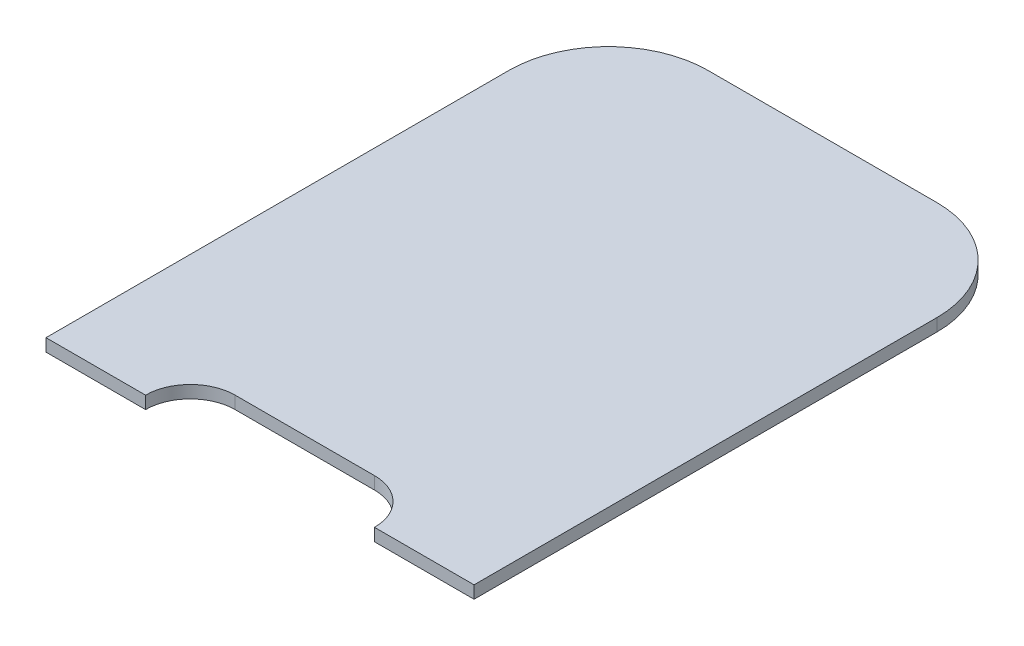
ISO-10303-21;
HEADER;
FILE_DESCRIPTION(('STEP AP214'),'2;1');
FILE_NAME('part.step','',(''),(''),'','','');
FILE_SCHEMA(('AUTOMOTIVE_DESIGN { 1 0 10303 214 1 1 1 1 }'));
ENDSEC;
DATA;
#1=APPLICATION_CONTEXT('core data for automotive mechanical design processes');
#2=APPLICATION_PROTOCOL_DEFINITION('international standard','automotive_design',2000,#1);
#3=PRODUCT_CONTEXT('',#1,'mechanical');
#4=PRODUCT('Part','Part','',(#3));
#5=PRODUCT_RELATED_PRODUCT_CATEGORY('part','',(#4));
#6=PRODUCT_DEFINITION_FORMATION('','',#4);
#7=PRODUCT_DEFINITION_CONTEXT('part definition',#1,'design');
#8=PRODUCT_DEFINITION('design','',#6,#7);
#9=PRODUCT_DEFINITION_SHAPE('','',#8);
#10=(LENGTH_UNIT() NAMED_UNIT(*) SI_UNIT(.MILLI.,.METRE.));
#11=(NAMED_UNIT(*) PLANE_ANGLE_UNIT() SI_UNIT($,.RADIAN.));
#12=(NAMED_UNIT(*) SI_UNIT($,.STERADIAN.) SOLID_ANGLE_UNIT());
#13=UNCERTAINTY_MEASURE_WITH_UNIT(LENGTH_MEASURE(1.E-05),#10,'distance_accuracy_value','');
#14=(GEOMETRIC_REPRESENTATION_CONTEXT(3) GLOBAL_UNCERTAINTY_ASSIGNED_CONTEXT((#13)) GLOBAL_UNIT_ASSIGNED_CONTEXT((#10,
#11,#12)) REPRESENTATION_CONTEXT('',''));
#15=CARTESIAN_POINT('',(0.,0.,0.));
#16=DIRECTION('',(0.,0.,1.));
#17=DIRECTION('',(1.,0.,0.));
#18=AXIS2_PLACEMENT_3D('',#15,#16,#17);
#19=CARTESIAN_POINT('',(0.,1.6,-59.0549999999999));
#20=DIRECTION('',(1.,0.,0.));
#21=DIRECTION('',(0.,0.,-1.));
#22=AXIS2_PLACEMENT_3D('',#19,#20,#21);
#23=PLANE('',#22);
#24=DIRECTION('',(0.,0.,1.));
#25=VECTOR('',#24,1.);
#26=CARTESIAN_POINT('',(0.,0.,-59.0549999999999));
#27=LINE('',#26,#25);
#28=CARTESIAN_POINT('',(0.,0.,-59.0549999999999));
#29=VERTEX_POINT('',#28);
#30=CARTESIAN_POINT('',(0.,0.,0.));
#31=VERTEX_POINT('',#30);
#32=EDGE_CURVE('E141',#29,#31,#27,.T.);
#33=ORIENTED_EDGE('',*,*,#32,.T.);
#34=DIRECTION('',(0.,-1.,0.));
#35=VECTOR('',#34,1.);
#36=CARTESIAN_POINT('',(0.,1.6,0.));
#37=LINE('',#36,#35);
#38=CARTESIAN_POINT('',(0.,1.6,0.));
#39=VERTEX_POINT('',#38);
#40=EDGE_CURVE('E11',#39,#31,#37,.T.);
#41=ORIENTED_EDGE('',*,*,#40,.F.);
#42=DIRECTION('',(0.,0.,1.));
#43=VECTOR('',#42,1.);
#44=CARTESIAN_POINT('',(0.,1.6,-59.0549999999999));
#45=LINE('',#44,#43);
#46=CARTESIAN_POINT('',(0.,1.6,-59.0549999999999));
#47=VERTEX_POINT('',#46);
#48=EDGE_CURVE('E159',#47,#39,#45,.T.);
#49=ORIENTED_EDGE('',*,*,#48,.F.);
#50=DIRECTION('',(0.,-1.,0.));
#51=VECTOR('',#50,1.);
#52=CARTESIAN_POINT('',(0.,1.6,-59.0549999999999));
#53=LINE('',#52,#51);
#54=EDGE_CURVE('E137',#47,#29,#53,.T.);
#55=ORIENTED_EDGE('',*,*,#54,.T.);
#56=EDGE_LOOP('',(#33,#41,#49,#55));
#57=FACE_BOUND('',#56,.T.);
#58=ADVANCED_FACE('F33',(#57),#23,.F.);
#59=CARTESIAN_POINT('',(0.,1.6,0.));
#60=DIRECTION('',(0.,0.,-1.));
#61=DIRECTION('',(-1.,0.,0.));
#62=AXIS2_PLACEMENT_3D('',#59,#60,#61);
#63=PLANE('',#62);
#64=DIRECTION('',(1.,0.,0.));
#65=VECTOR('',#64,1.);
#66=CARTESIAN_POINT('',(0.,0.,0.));
#67=LINE('',#66,#65);
#68=CARTESIAN_POINT('',(12.7,0.,0.));
#69=VERTEX_POINT('',#68);
#70=EDGE_CURVE('E144',#31,#69,#67,.T.);
#71=ORIENTED_EDGE('',*,*,#70,.T.);
#72=DIRECTION('',(0.,-1.,0.));
#73=VECTOR('',#72,1.);
#74=CARTESIAN_POINT('',(12.7,1.6,0.));
#75=LINE('',#74,#73);
#76=CARTESIAN_POINT('',(12.7,1.6,0.));
#77=VERTEX_POINT('',#76);
#78=EDGE_CURVE('E41',#77,#69,#75,.T.);
#79=ORIENTED_EDGE('',*,*,#78,.F.);
#80=DIRECTION('',(1.,0.,0.));
#81=VECTOR('',#80,1.);
#82=CARTESIAN_POINT('',(0.,1.6,0.));
#83=LINE('',#82,#81);
#84=EDGE_CURVE('E98',#39,#77,#83,.T.);
#85=ORIENTED_EDGE('',*,*,#84,.F.);
#86=ORIENTED_EDGE('',*,*,#40,.T.);
#87=EDGE_LOOP('',(#71,#79,#85,#86));
#88=FACE_BOUND('',#87,.T.);
#89=ADVANCED_FACE('F208',(#88),#63,.F.);
#90=CARTESIAN_POINT('',(18.415,1.6,0.));
#91=DIRECTION('',(0.,-1.,0.));
#92=DIRECTION('',(0.,0.,-1.));
#93=AXIS2_PLACEMENT_3D('',#90,#91,#92);
#94=CYLINDRICAL_SURFACE('',#93,5.715);
#95=CARTESIAN_POINT('',(18.415,0.,0.));
#96=DIRECTION('',(0.,-1.,0.));
#97=DIRECTION('',(0.,0.,1.));
#98=AXIS2_PLACEMENT_3D('',#95,#96,#97);
#99=CIRCLE('',#98,5.715);
#100=CARTESIAN_POINT('',(18.415,0.,-5.715));
#101=VERTEX_POINT('',#100);
#102=EDGE_CURVE('E146',#69,#101,#99,.T.);
#103=ORIENTED_EDGE('',*,*,#102,.T.);
#104=DIRECTION('',(0.,-1.,0.));
#105=VECTOR('',#104,1.);
#106=CARTESIAN_POINT('',(18.415,1.6,-5.715));
#107=LINE('',#106,#105);
#108=CARTESIAN_POINT('',(18.415,1.6,-5.715));
#109=VERTEX_POINT('',#108);
#110=EDGE_CURVE('E172',#109,#101,#107,.T.);
#111=ORIENTED_EDGE('',*,*,#110,.F.);
#112=CARTESIAN_POINT('',(18.415,1.6,0.));
#113=DIRECTION('',(0.,-1.,0.));
#114=DIRECTION('',(0.,0.,1.));
#115=AXIS2_PLACEMENT_3D('',#112,#113,#114);
#116=CIRCLE('',#115,5.715);
#117=EDGE_CURVE('E180',#77,#109,#116,.T.);
#118=ORIENTED_EDGE('',*,*,#117,.F.);
#119=ORIENTED_EDGE('',*,*,#78,.T.);
#120=EDGE_LOOP('',(#103,#111,#118,#119));
#121=FACE_BOUND('',#120,.T.);
#122=ADVANCED_FACE('F178',(#121),#94,.F.);
#123=CARTESIAN_POINT('',(18.415,1.6,-5.715));
#124=DIRECTION('',(0.,0.,-1.));
#125=DIRECTION('',(-1.,0.,0.));
#126=AXIS2_PLACEMENT_3D('',#123,#124,#125);
#127=PLANE('',#126);
#128=DIRECTION('',(1.,0.,0.));
#129=VECTOR('',#128,1.);
#130=CARTESIAN_POINT('',(18.415,0.,-5.715));
#131=LINE('',#130,#129);
#132=CARTESIAN_POINT('',(36.195,0.,-5.715));
#133=VERTEX_POINT('',#132);
#134=EDGE_CURVE('E148',#101,#133,#131,.T.);
#135=ORIENTED_EDGE('',*,*,#134,.T.);
#136=DIRECTION('',(0.,-1.,0.));
#137=VECTOR('',#136,1.);
#138=CARTESIAN_POINT('',(36.195,1.6,-5.715));
#139=LINE('',#138,#137);
#140=CARTESIAN_POINT('',(36.195,1.6,-5.715));
#141=VERTEX_POINT('',#140);
#142=EDGE_CURVE('E169',#141,#133,#139,.T.);
#143=ORIENTED_EDGE('',*,*,#142,.F.);
#144=DIRECTION('',(1.,0.,0.));
#145=VECTOR('',#144,1.);
#146=CARTESIAN_POINT('',(18.415,1.6,-5.715));
#147=LINE('',#146,#145);
#148=EDGE_CURVE('E198',#109,#141,#147,.T.);
#149=ORIENTED_EDGE('',*,*,#148,.F.);
#150=ORIENTED_EDGE('',*,*,#110,.T.);
#151=EDGE_LOOP('',(#135,#143,#149,#150));
#152=FACE_BOUND('',#151,.T.);
#153=ADVANCED_FACE('F189',(#152),#127,.F.);
#154=CARTESIAN_POINT('',(36.195,1.6,0.));
#155=DIRECTION('',(0.,-1.,0.));
#156=DIRECTION('',(0.,0.,-1.));
#157=AXIS2_PLACEMENT_3D('',#154,#155,#156);
#158=CYLINDRICAL_SURFACE('',#157,5.715);
#159=CARTESIAN_POINT('',(36.195,0.,0.));
#160=DIRECTION('',(0.,-1.,0.));
#161=DIRECTION('',(0.,0.,-1.));
#162=AXIS2_PLACEMENT_3D('',#159,#160,#161);
#163=CIRCLE('',#162,5.715);
#164=CARTESIAN_POINT('',(41.91,0.,0.));
#165=VERTEX_POINT('',#164);
#166=EDGE_CURVE('E150',#133,#165,#163,.T.);
#167=ORIENTED_EDGE('',*,*,#166,.T.);
#168=DIRECTION('',(0.,-1.,0.));
#169=VECTOR('',#168,1.);
#170=CARTESIAN_POINT('',(41.91,1.6,0.));
#171=LINE('',#170,#169);
#172=CARTESIAN_POINT('',(41.91,1.6,0.));
#173=VERTEX_POINT('',#172);
#174=EDGE_CURVE('E166',#173,#165,#171,.T.);
#175=ORIENTED_EDGE('',*,*,#174,.F.);
#176=CARTESIAN_POINT('',(36.195,1.6,0.));
#177=DIRECTION('',(0.,-1.,0.));
#178=DIRECTION('',(0.,0.,-1.));
#179=AXIS2_PLACEMENT_3D('',#176,#177,#178);
#180=CIRCLE('',#179,5.715);
#181=EDGE_CURVE('E195',#141,#173,#180,.T.);
#182=ORIENTED_EDGE('',*,*,#181,.F.);
#183=ORIENTED_EDGE('',*,*,#142,.T.);
#184=EDGE_LOOP('',(#167,#175,#182,#183));
#185=FACE_BOUND('',#184,.T.);
#186=ADVANCED_FACE('F193',(#185),#158,.F.);
#187=CARTESIAN_POINT('',(41.91,1.6,0.));
#188=DIRECTION('',(0.,0.,-1.));
#189=DIRECTION('',(-1.,0.,0.));
#190=AXIS2_PLACEMENT_3D('',#187,#188,#189);
#191=PLANE('',#190);
#192=DIRECTION('',(1.,0.,0.));
#193=VECTOR('',#192,1.);
#194=CARTESIAN_POINT('',(41.91,0.,0.));
#195=LINE('',#194,#193);
#196=CARTESIAN_POINT('',(54.61,0.,0.));
#197=VERTEX_POINT('',#196);
#198=EDGE_CURVE('E152',#165,#197,#195,.T.);
#199=ORIENTED_EDGE('',*,*,#198,.T.);
#200=DIRECTION('',(0.,-1.,0.));
#201=VECTOR('',#200,1.);
#202=CARTESIAN_POINT('',(54.61,1.6,0.));
#203=LINE('',#202,#201);
#204=CARTESIAN_POINT('',(54.61,1.6,0.));
#205=VERTEX_POINT('',#204);
#206=EDGE_CURVE('E163',#205,#197,#203,.T.);
#207=ORIENTED_EDGE('',*,*,#206,.F.);
#208=DIRECTION('',(1.,0.,0.));
#209=VECTOR('',#208,1.);
#210=CARTESIAN_POINT('',(41.91,1.6,0.));
#211=LINE('',#210,#209);
#212=EDGE_CURVE('E197',#173,#205,#211,.T.);
#213=ORIENTED_EDGE('',*,*,#212,.F.);
#214=ORIENTED_EDGE('',*,*,#174,.T.);
#215=EDGE_LOOP('',(#199,#207,#213,#214));
#216=FACE_BOUND('',#215,.T.);
#217=ADVANCED_FACE('F220',(#216),#191,.F.);
#218=CARTESIAN_POINT('',(54.61,1.6,0.));
#219=DIRECTION('',(-1.,0.,0.));
#220=DIRECTION('',(0.,0.,1.));
#221=AXIS2_PLACEMENT_3D('',#218,#219,#220);
#222=PLANE('',#221);
#223=DIRECTION('',(0.,0.,-1.));
#224=VECTOR('',#223,1.);
#225=CARTESIAN_POINT('',(54.61,0.,0.));
#226=LINE('',#225,#224);
#227=CARTESIAN_POINT('',(54.61,0.,-59.055));
#228=VERTEX_POINT('',#227);
#229=EDGE_CURVE('E154',#197,#228,#226,.T.);
#230=ORIENTED_EDGE('',*,*,#229,.T.);
#231=DIRECTION('',(0.,-1.,0.));
#232=VECTOR('',#231,1.);
#233=CARTESIAN_POINT('',(54.61,1.6,-59.055));
#234=LINE('',#233,#232);
#235=CARTESIAN_POINT('',(54.61,1.6,-59.055));
#236=VERTEX_POINT('',#235);
#237=EDGE_CURVE('E132',#236,#228,#234,.T.);
#238=ORIENTED_EDGE('',*,*,#237,.F.);
#239=DIRECTION('',(0.,0.,-1.));
#240=VECTOR('',#239,1.);
#241=CARTESIAN_POINT('',(54.61,1.6,0.));
#242=LINE('',#241,#240);
#243=EDGE_CURVE('E123',#205,#236,#242,.T.);
#244=ORIENTED_EDGE('',*,*,#243,.F.);
#245=ORIENTED_EDGE('',*,*,#206,.T.);
#246=EDGE_LOOP('',(#230,#238,#244,#245));
#247=FACE_BOUND('',#246,.T.);
#248=ADVANCED_FACE('F223',(#247),#222,.F.);
#249=CARTESIAN_POINT('',(41.91,1.6,-59.055));
#250=DIRECTION('',(0.,-1.,0.));
#251=DIRECTION('',(0.,0.,-1.));
#252=AXIS2_PLACEMENT_3D('',#249,#250,#251);
#253=CYLINDRICAL_SURFACE('',#252,12.7);
#254=CARTESIAN_POINT('',(41.91,0.,-59.055));
#255=DIRECTION('',(0.,1.,0.));
#256=DIRECTION('',(0.,0.,-1.));
#257=AXIS2_PLACEMENT_3D('',#254,#255,#256);
#258=CIRCLE('',#257,12.7);
#259=CARTESIAN_POINT('',(41.91,0.,-71.755));
#260=VERTEX_POINT('',#259);
#261=EDGE_CURVE('E131',#228,#260,#258,.T.);
#262=ORIENTED_EDGE('',*,*,#261,.T.);
#263=DIRECTION('',(0.,-1.,0.));
#264=VECTOR('',#263,1.);
#265=CARTESIAN_POINT('',(41.91,1.6,-71.755));
#266=LINE('',#265,#264);
#267=CARTESIAN_POINT('',(41.91,1.6,-71.755));
#268=VERTEX_POINT('',#267);
#269=EDGE_CURVE('E128',#268,#260,#266,.T.);
#270=ORIENTED_EDGE('',*,*,#269,.F.);
#271=CARTESIAN_POINT('',(41.91,1.6,-59.055));
#272=DIRECTION('',(0.,1.,0.));
#273=DIRECTION('',(0.,0.,-1.));
#274=AXIS2_PLACEMENT_3D('',#271,#272,#273);
#275=CIRCLE('',#274,12.7);
#276=EDGE_CURVE('E117',#236,#268,#275,.T.);
#277=ORIENTED_EDGE('',*,*,#276,.F.);
#278=ORIENTED_EDGE('',*,*,#237,.T.);
#279=EDGE_LOOP('',(#262,#270,#277,#278));
#280=FACE_BOUND('',#279,.T.);
#281=ADVANCED_FACE('F129',(#280),#253,.T.);
#282=CARTESIAN_POINT('',(41.91,1.6,-71.755));
#283=DIRECTION('',(0.,0.,1.));
#284=DIRECTION('',(1.,0.,0.));
#285=AXIS2_PLACEMENT_3D('',#282,#283,#284);
#286=PLANE('',#285);
#287=DIRECTION('',(-1.,0.,0.));
#288=VECTOR('',#287,1.);
#289=CARTESIAN_POINT('',(41.91,0.,-71.755));
#290=LINE('',#289,#288);
#291=CARTESIAN_POINT('',(12.7000000000001,0.,-71.755));
#292=VERTEX_POINT('',#291);
#293=EDGE_CURVE('E84',#260,#292,#290,.T.);
#294=ORIENTED_EDGE('',*,*,#293,.T.);
#295=DIRECTION('',(0.,-1.,0.));
#296=VECTOR('',#295,1.);
#297=CARTESIAN_POINT('',(12.7000000000001,1.6,-71.755));
#298=LINE('',#297,#296);
#299=CARTESIAN_POINT('',(12.7000000000001,1.6,-71.755));
#300=VERTEX_POINT('',#299);
#301=EDGE_CURVE('E133',#300,#292,#298,.T.);
#302=ORIENTED_EDGE('',*,*,#301,.F.);
#303=DIRECTION('',(-1.,0.,0.));
#304=VECTOR('',#303,1.);
#305=CARTESIAN_POINT('',(41.91,1.6,-71.755));
#306=LINE('',#305,#304);
#307=EDGE_CURVE('E121',#268,#300,#306,.T.);
#308=ORIENTED_EDGE('',*,*,#307,.F.);
#309=ORIENTED_EDGE('',*,*,#269,.T.);
#310=EDGE_LOOP('',(#294,#302,#308,#309));
#311=FACE_BOUND('',#310,.T.);
#312=ADVANCED_FACE('F135',(#311),#286,.F.);
#313=CARTESIAN_POINT('',(12.7,1.6,-59.055));
#314=DIRECTION('',(0.,-1.,0.));
#315=DIRECTION('',(0.,0.,-1.));
#316=AXIS2_PLACEMENT_3D('',#313,#314,#315);
#317=CYLINDRICAL_SURFACE('',#316,12.7);
#318=CARTESIAN_POINT('',(12.7,0.,-59.055));
#319=DIRECTION('',(0.,1.,0.));
#320=DIRECTION('',(0.,0.,1.));
#321=AXIS2_PLACEMENT_3D('',#318,#319,#320);
#322=CIRCLE('',#321,12.7);
#323=EDGE_CURVE('E90',#292,#29,#322,.T.);
#324=ORIENTED_EDGE('',*,*,#323,.T.);
#325=ORIENTED_EDGE('',*,*,#54,.F.);
#326=CARTESIAN_POINT('',(12.7,1.6,-59.055));
#327=DIRECTION('',(0.,1.,0.));
#328=DIRECTION('',(0.,0.,1.));
#329=AXIS2_PLACEMENT_3D('',#326,#327,#328);
#330=CIRCLE('',#329,12.7);
#331=EDGE_CURVE('E49',#300,#47,#330,.T.);
#332=ORIENTED_EDGE('',*,*,#331,.F.);
#333=ORIENTED_EDGE('',*,*,#301,.T.);
#334=EDGE_LOOP('',(#324,#325,#332,#333));
#335=FACE_BOUND('',#334,.T.);
#336=ADVANCED_FACE('F232',(#335),#317,.T.);
#337=CARTESIAN_POINT('',(18.415,1.6,0.));
#338=DIRECTION('',(0.,1.,0.));
#339=DIRECTION('',(0.,0.,1.));
#340=AXIS2_PLACEMENT_3D('',#337,#338,#339);
#341=PLANE('',#340);
#342=ORIENTED_EDGE('',*,*,#48,.T.);
#343=ORIENTED_EDGE('',*,*,#84,.T.);
#344=ORIENTED_EDGE('',*,*,#117,.T.);
#345=ORIENTED_EDGE('',*,*,#148,.T.);
#346=ORIENTED_EDGE('',*,*,#181,.T.);
#347=ORIENTED_EDGE('',*,*,#212,.T.);
#348=ORIENTED_EDGE('',*,*,#243,.T.);
#349=ORIENTED_EDGE('',*,*,#276,.T.);
#350=ORIENTED_EDGE('',*,*,#307,.T.);
#351=ORIENTED_EDGE('',*,*,#331,.T.);
#352=EDGE_LOOP('',(#342,#343,#344,#345,#346,#347,#348,#349,#350,#351));
#353=FACE_BOUND('',#352,.T.);
#354=ADVANCED_FACE('F119',(#353),#341,.T.);
#355=CARTESIAN_POINT('',(18.415,0.,0.));
#356=DIRECTION('',(0.,1.,0.));
#357=DIRECTION('',(0.,0.,1.));
#358=AXIS2_PLACEMENT_3D('',#355,#356,#357);
#359=PLANE('',#358);
#360=ORIENTED_EDGE('',*,*,#32,.F.);
#361=ORIENTED_EDGE('',*,*,#323,.F.);
#362=ORIENTED_EDGE('',*,*,#293,.F.);
#363=ORIENTED_EDGE('',*,*,#261,.F.);
#364=ORIENTED_EDGE('',*,*,#229,.F.);
#365=ORIENTED_EDGE('',*,*,#198,.F.);
#366=ORIENTED_EDGE('',*,*,#166,.F.);
#367=ORIENTED_EDGE('',*,*,#134,.F.);
#368=ORIENTED_EDGE('',*,*,#102,.F.);
#369=ORIENTED_EDGE('',*,*,#70,.F.);
#370=EDGE_LOOP('',(#360,#361,#362,#363,#364,#365,#366,#367,#368,#369));
#371=FACE_BOUND('',#370,.T.);
#372=ADVANCED_FACE('F184',(#371),#359,.F.);
#373=CLOSED_SHELL('',(#58,#89,#122,#153,#186,#217,#248,#281,#312,#336,#354,#372));
#374=MANIFOLD_SOLID_BREP('B2',#373);
#375=ADVANCED_BREP_SHAPE_REPRESENTATION('',(#18,#374),#14);
#376=SHAPE_DEFINITION_REPRESENTATION(#9,#375);
ENDSEC;
END-ISO-10303-21;
